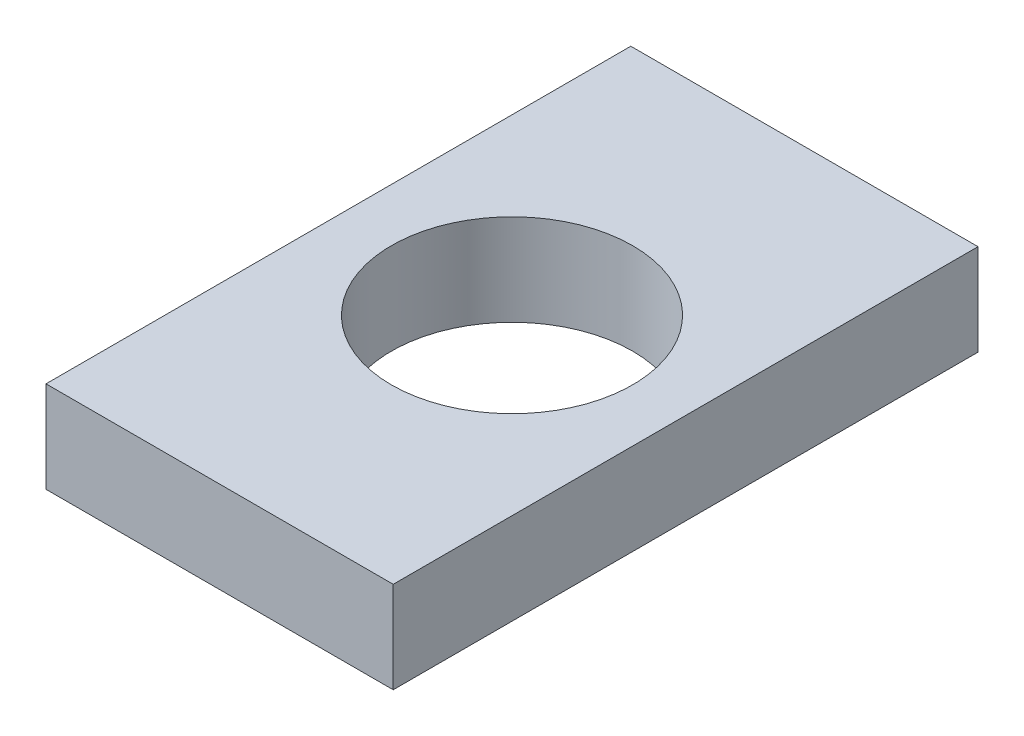
ISO-10303-21;
HEADER;
FILE_DESCRIPTION(('STEP AP214'),'2;1');
FILE_NAME('part.step','',(''),(''),'','','');
FILE_SCHEMA(('AUTOMOTIVE_DESIGN { 1 0 10303 214 1 1 1 1 }'));
ENDSEC;
DATA;
#1=APPLICATION_CONTEXT('core data for automotive mechanical design processes');
#2=APPLICATION_PROTOCOL_DEFINITION('international standard','automotive_design',2000,#1);
#3=PRODUCT_CONTEXT('',#1,'mechanical');
#4=PRODUCT('Part','Part','',(#3));
#5=PRODUCT_RELATED_PRODUCT_CATEGORY('part','',(#4));
#6=PRODUCT_DEFINITION_FORMATION('','',#4);
#7=PRODUCT_DEFINITION_CONTEXT('part definition',#1,'design');
#8=PRODUCT_DEFINITION('design','',#6,#7);
#9=PRODUCT_DEFINITION_SHAPE('','',#8);
#10=(LENGTH_UNIT() NAMED_UNIT(*) SI_UNIT(.MILLI.,.METRE.));
#11=(NAMED_UNIT(*) PLANE_ANGLE_UNIT() SI_UNIT($,.RADIAN.));
#12=(NAMED_UNIT(*) SI_UNIT($,.STERADIAN.) SOLID_ANGLE_UNIT());
#13=UNCERTAINTY_MEASURE_WITH_UNIT(LENGTH_MEASURE(1.E-05),#10,'distance_accuracy_value','');
#14=(GEOMETRIC_REPRESENTATION_CONTEXT(3) GLOBAL_UNCERTAINTY_ASSIGNED_CONTEXT((#13)) GLOBAL_UNIT_ASSIGNED_CONTEXT((#10,
#11,#12)) REPRESENTATION_CONTEXT('',''));
#15=CARTESIAN_POINT('',(0.,0.,0.));
#16=DIRECTION('',(0.,0.,1.));
#17=DIRECTION('',(1.,0.,0.));
#18=AXIS2_PLACEMENT_3D('',#15,#16,#17);
#19=CARTESIAN_POINT('',(-3.88578058618805E-13,1.24999999999997,5.55111512312578E-13));
#20=DIRECTION('',(1.00000000000001,0.,0.));
#21=DIRECTION('',(0.,0.,-0.999999999999994));
#22=AXIS2_PLACEMENT_3D('',#19,#20,#21);
#23=PLANE('',#22);
#24=DIRECTION('',(0.,0.,0.999999999999994));
#25=VECTOR('',#24,1.);
#26=CARTESIAN_POINT('',(0.,0.,0.));
#27=LINE('',#26,#25);
#28=CARTESIAN_POINT('',(-3.88578058618805E-13,1.70002900645727E-13,-7.99999999999956));
#29=VERTEX_POINT('',#28);
#30=CARTESIAN_POINT('',(0.,0.,0.));
#31=VERTEX_POINT('',#30);
#32=EDGE_CURVE('E117',#29,#31,#27,.T.);
#33=ORIENTED_EDGE('',*,*,#32,.T.);
#34=DIRECTION('',(0.,-0.999999999999992,0.));
#35=VECTOR('',#34,1.);
#36=CARTESIAN_POINT('',(-3.88578058618805E-13,1.24999999999997,5.55111512312578E-13));
#37=LINE('',#36,#35);
#38=CARTESIAN_POINT('',(-3.88578058618805E-13,1.24999999999997,5.55111512312578E-13));
#39=VERTEX_POINT('',#38);
#40=EDGE_CURVE('E13',#39,#31,#37,.T.);
#41=ORIENTED_EDGE('',*,*,#40,.F.);
#42=DIRECTION('',(0.,0.,0.999999999999994));
#43=VECTOR('',#42,1.);
#44=CARTESIAN_POINT('',(-3.88578058618805E-13,1.24999999999997,5.55111512312578E-13));
#45=LINE('',#44,#43);
#46=CARTESIAN_POINT('',(-3.88578058618805E-13,1.24999999999998,-7.9999999999994));
#47=VERTEX_POINT('',#46);
#48=EDGE_CURVE('E105',#47,#39,#45,.T.);
#49=ORIENTED_EDGE('',*,*,#48,.F.);
#50=DIRECTION('',(0.,-0.999999999999992,0.));
#51=VECTOR('',#50,1.);
#52=CARTESIAN_POINT('',(-3.88578058618805E-13,1.24999999999998,-7.9999999999994));
#53=LINE('',#52,#51);
#54=EDGE_CURVE('E113',#47,#29,#53,.T.);
#55=ORIENTED_EDGE('',*,*,#54,.T.);
#56=EDGE_LOOP('',(#33,#41,#49,#55));
#57=FACE_BOUND('',#56,.T.);
#58=ADVANCED_FACE('F54',(#57),#23,.F.);
#59=CARTESIAN_POINT('',(-3.88578058618805E-13,1.24999999999997,5.55111512312578E-13));
#60=DIRECTION('',(0.,0.,-0.999999999999994));
#61=DIRECTION('',(-1.00000000000001,0.,0.));
#62=AXIS2_PLACEMENT_3D('',#59,#60,#61);
#63=PLANE('',#62);
#64=DIRECTION('',(1.00000000000001,0.,0.));
#65=VECTOR('',#64,1.);
#66=CARTESIAN_POINT('',(0.,0.,0.));
#67=LINE('',#66,#65);
#68=CARTESIAN_POINT('',(4.74999999999959,1.11022302462516E-13,2.22044604925031E-13));
#69=VERTEX_POINT('',#68);
#70=EDGE_CURVE('E109',#31,#69,#67,.T.);
#71=ORIENTED_EDGE('',*,*,#70,.T.);
#72=DIRECTION('',(0.,-0.999999999999992,0.));
#73=VECTOR('',#72,1.);
#74=CARTESIAN_POINT('',(4.74999999999964,1.24999999999997,4.44089209850063E-13));
#75=LINE('',#74,#73);
#76=CARTESIAN_POINT('',(4.74999999999964,1.24999999999997,4.44089209850063E-13));
#77=VERTEX_POINT('',#76);
#78=EDGE_CURVE('E62',#77,#69,#75,.T.);
#79=ORIENTED_EDGE('',*,*,#78,.F.);
#80=DIRECTION('',(1.00000000000001,0.,0.));
#81=VECTOR('',#80,1.);
#82=CARTESIAN_POINT('',(-3.88578058618805E-13,1.24999999999997,5.55111512312578E-13));
#83=LINE('',#82,#81);
#84=EDGE_CURVE('E100',#39,#77,#83,.T.);
#85=ORIENTED_EDGE('',*,*,#84,.F.);
#86=ORIENTED_EDGE('',*,*,#40,.T.);
#87=EDGE_LOOP('',(#71,#79,#85,#86));
#88=FACE_BOUND('',#87,.T.);
#89=ADVANCED_FACE('F108',(#88),#63,.F.);
#90=CARTESIAN_POINT('',(4.74999999999964,1.24999999999997,4.44089209850063E-13));
#91=DIRECTION('',(-1.00000000000001,0.,0.));
#92=DIRECTION('',(0.,0.,0.999999999999994));
#93=AXIS2_PLACEMENT_3D('',#90,#91,#92);
#94=PLANE('',#93);
#95=DIRECTION('',(0.,0.,-0.999999999999994));
#96=VECTOR('',#95,1.);
#97=CARTESIAN_POINT('',(4.74999999999959,1.11022302462516E-13,2.22044604925031E-13));
#98=LINE('',#97,#96);
#99=CARTESIAN_POINT('',(4.74999999999992,1.66533453693773E-13,-7.99999999999995));
#100=VERTEX_POINT('',#99);
#101=EDGE_CURVE('E87',#69,#100,#98,.T.);
#102=ORIENTED_EDGE('',*,*,#101,.T.);
#103=DIRECTION('',(0.,-0.999999999999992,0.));
#104=VECTOR('',#103,1.);
#105=CARTESIAN_POINT('',(4.7499999999997,1.25000000000014,-7.99999999999967));
#106=LINE('',#105,#104);
#107=CARTESIAN_POINT('',(4.7499999999997,1.25000000000014,-7.99999999999967));
#108=VERTEX_POINT('',#107);
#109=EDGE_CURVE('E110',#108,#100,#106,.T.);
#110=ORIENTED_EDGE('',*,*,#109,.F.);
#111=DIRECTION('',(0.,0.,-0.999999999999994));
#112=VECTOR('',#111,1.);
#113=CARTESIAN_POINT('',(4.74999999999964,1.24999999999997,4.44089209850063E-13));
#114=LINE('',#113,#112);
#115=EDGE_CURVE('E103',#77,#108,#114,.T.);
#116=ORIENTED_EDGE('',*,*,#115,.F.);
#117=ORIENTED_EDGE('',*,*,#78,.T.);
#118=EDGE_LOOP('',(#102,#110,#116,#117));
#119=FACE_BOUND('',#118,.T.);
#120=ADVANCED_FACE('F111',(#119),#94,.F.);
#121=CARTESIAN_POINT('',(-3.88578058618805E-13,1.24999999999998,-7.9999999999994));
#122=DIRECTION('',(0.,0.,0.999999999999993));
#123=DIRECTION('',(1.00000000000001,0.,0.));
#124=AXIS2_PLACEMENT_3D('',#121,#122,#123);
#125=PLANE('',#124);
#126=DIRECTION('',(-1.00000000000001,0.,0.));
#127=VECTOR('',#126,1.);
#128=CARTESIAN_POINT('',(-3.88578058618805E-13,1.70002900645727E-13,-7.99999999999956));
#129=LINE('',#128,#127);
#130=EDGE_CURVE('E93',#100,#29,#129,.T.);
#131=ORIENTED_EDGE('',*,*,#130,.T.);
#132=ORIENTED_EDGE('',*,*,#54,.F.);
#133=DIRECTION('',(-1.00000000000001,0.,0.));
#134=VECTOR('',#133,1.);
#135=CARTESIAN_POINT('',(-3.88578058618805E-13,1.24999999999998,-7.9999999999994));
#136=LINE('',#135,#134);
#137=EDGE_CURVE('E70',#108,#47,#136,.T.);
#138=ORIENTED_EDGE('',*,*,#137,.F.);
#139=ORIENTED_EDGE('',*,*,#109,.T.);
#140=EDGE_LOOP('',(#131,#132,#138,#139));
#141=FACE_BOUND('',#140,.T.);
#142=ADVANCED_FACE('F125',(#141),#125,.F.);
#143=CARTESIAN_POINT('',(-3.88578058618805E-13,1.24999999999997,5.55111512312578E-13));
#144=DIRECTION('',(0.,-0.999999999999992,0.));
#145=DIRECTION('',(0.,0.,-0.999999999999994));
#146=AXIS2_PLACEMENT_3D('',#143,#144,#145);
#147=PLANE('',#146);
#148=CARTESIAN_POINT('',(2.37499999999952,1.24999999999997,-3.99999999999961));
#149=DIRECTION('',(0.,0.999999999999992,0.));
#150=DIRECTION('',(0.,0.,0.999999999999994));
#151=AXIS2_PLACEMENT_3D('',#148,#149,#150);
#152=CIRCLE('',#151,1.65);
#153=CARTESIAN_POINT('',(2.37499999999952,1.24999999999997,-2.34999999999963));
#154=VERTEX_POINT('',#153);
#155=EDGE_CURVE('E133',#154,#154,#152,.T.);
#156=ORIENTED_EDGE('',*,*,#155,.F.);
#157=EDGE_LOOP('',(#156));
#158=FACE_BOUND('',#157,.T.);
#159=ORIENTED_EDGE('',*,*,#48,.T.);
#160=ORIENTED_EDGE('',*,*,#84,.T.);
#161=ORIENTED_EDGE('',*,*,#115,.T.);
#162=ORIENTED_EDGE('',*,*,#137,.T.);
#163=EDGE_LOOP('',(#159,#160,#161,#162));
#164=FACE_BOUND('',#163,.T.);
#165=ADVANCED_FACE('F101',(#158,#164),#147,.F.);
#166=CARTESIAN_POINT('',(0.,0.,0.));
#167=DIRECTION('',(0.,-0.999999999999992,0.));
#168=DIRECTION('',(0.,0.,-0.999999999999994));
#169=AXIS2_PLACEMENT_3D('',#166,#167,#168);
#170=PLANE('',#169);
#171=CARTESIAN_POINT('',(2.37499999999985,0.,-3.99999999999956));
#172=DIRECTION('',(0.,0.999999999999992,0.));
#173=DIRECTION('',(0.,0.,0.999999999999994));
#174=AXIS2_PLACEMENT_3D('',#171,#172,#173);
#175=CIRCLE('',#174,1.65);
#176=CARTESIAN_POINT('',(2.37499999999952,0.,-2.34999999999963));
#177=VERTEX_POINT('',#176);
#178=EDGE_CURVE('E120',#177,#177,#175,.T.);
#179=ORIENTED_EDGE('',*,*,#178,.T.);
#180=EDGE_LOOP('',(#179));
#181=FACE_BOUND('',#180,.T.);
#182=ORIENTED_EDGE('',*,*,#32,.F.);
#183=ORIENTED_EDGE('',*,*,#130,.F.);
#184=ORIENTED_EDGE('',*,*,#101,.F.);
#185=ORIENTED_EDGE('',*,*,#70,.F.);
#186=EDGE_LOOP('',(#182,#183,#184,#185));
#187=FACE_BOUND('',#186,.T.);
#188=ADVANCED_FACE('F128',(#181,#187),#170,.T.);
#189=CARTESIAN_POINT('',(2.37499999999952,1.24999999999997,-3.99999999999961));
#190=DIRECTION('',(0.,0.999999999999992,0.));
#191=DIRECTION('',(0.,0.,0.999999999999994));
#192=AXIS2_PLACEMENT_3D('',#189,#190,#191);
#193=CYLINDRICAL_SURFACE('',#192,1.65);
#194=CARTESIAN_POINT('',(2.37499999999952,0.,-2.34999999999963));
#195=CARTESIAN_POINT('',(2.37499999999952,0.0130208333333313,-2.34999999999963));
#196=CARTESIAN_POINT('',(2.37499999999952,0.0260416666666644,-2.34999999999963));
#197=CARTESIAN_POINT('',(2.37499999999952,0.0520833333333305,-2.34999999999963));
#198=CARTESIAN_POINT('',(2.37499999999952,0.0651041666666635,-2.34999999999963));
#199=CARTESIAN_POINT('',(2.37499999999952,0.0911458333333297,-2.34999999999963));
#200=CARTESIAN_POINT('',(2.37499999999952,0.104166666666663,-2.34999999999963));
#201=CARTESIAN_POINT('',(2.37499999999952,0.130208333333329,-2.34999999999963));
#202=CARTESIAN_POINT('',(2.37499999999952,0.143229166666662,-2.34999999999963));
#203=CARTESIAN_POINT('',(2.37499999999952,0.169270833333328,-2.34999999999963));
#204=CARTESIAN_POINT('',(2.37499999999952,0.182291666666661,-2.34999999999963));
#205=CARTESIAN_POINT('',(2.37499999999952,0.208333333333327,-2.34999999999963));
#206=CARTESIAN_POINT('',(2.37499999999952,0.22135416666666,-2.34999999999963));
#207=CARTESIAN_POINT('',(2.37499999999952,0.247395833333326,-2.34999999999963));
#208=CARTESIAN_POINT('',(2.37499999999952,0.260416666666659,-2.34999999999963));
#209=CARTESIAN_POINT('',(2.37499999999952,0.286458333333326,-2.34999999999963));
#210=CARTESIAN_POINT('',(2.37499999999952,0.299479166666659,-2.34999999999963));
#211=CARTESIAN_POINT('',(2.37499999999952,0.325520833333325,-2.34999999999963));
#212=CARTESIAN_POINT('',(2.37499999999952,0.338541666666658,-2.34999999999963));
#213=CARTESIAN_POINT('',(2.37499999999952,0.364583333333324,-2.34999999999963));
#214=CARTESIAN_POINT('',(2.37499999999952,0.377604166666657,-2.34999999999963));
#215=CARTESIAN_POINT('',(2.37499999999952,0.403645833333323,-2.34999999999963));
#216=CARTESIAN_POINT('',(2.37499999999952,0.416666666666656,-2.34999999999963));
#217=CARTESIAN_POINT('',(2.37499999999952,0.442708333333322,-2.34999999999963));
#218=CARTESIAN_POINT('',(2.37499999999952,0.455729166666655,-2.34999999999963));
#219=CARTESIAN_POINT('',(2.37499999999952,0.481770833333321,-2.34999999999963));
#220=CARTESIAN_POINT('',(2.37499999999952,0.494791666666654,-2.34999999999963));
#221=CARTESIAN_POINT('',(2.37499999999952,0.520833333333321,-2.34999999999963));
#222=CARTESIAN_POINT('',(2.37499999999952,0.533854166666654,-2.34999999999963));
#223=CARTESIAN_POINT('',(2.37499999999952,0.55989583333332,-2.34999999999963));
#224=CARTESIAN_POINT('',(2.37499999999952,0.572916666666653,-2.34999999999963));
#225=CARTESIAN_POINT('',(2.37499999999952,0.598958333333319,-2.34999999999963));
#226=CARTESIAN_POINT('',(2.37499999999952,0.611979166666652,-2.34999999999963));
#227=CARTESIAN_POINT('',(2.37499999999952,0.638020833333318,-2.34999999999963));
#228=CARTESIAN_POINT('',(2.37499999999952,0.651041666666651,-2.34999999999963));
#229=CARTESIAN_POINT('',(2.37499999999952,0.677083333333317,-2.34999999999963));
#230=CARTESIAN_POINT('',(2.37499999999952,0.69010416666665,-2.34999999999963));
#231=CARTESIAN_POINT('',(2.37499999999952,0.716145833333316,-2.34999999999963));
#232=CARTESIAN_POINT('',(2.37499999999952,0.729166666666649,-2.34999999999963));
#233=CARTESIAN_POINT('',(2.37499999999952,0.755208333333316,-2.34999999999963));
#234=CARTESIAN_POINT('',(2.37499999999952,0.768229166666649,-2.34999999999963));
#235=CARTESIAN_POINT('',(2.37499999999952,0.794270833333315,-2.34999999999963));
#236=CARTESIAN_POINT('',(2.37499999999952,0.807291666666648,-2.34999999999963));
#237=CARTESIAN_POINT('',(2.37499999999952,0.833333333333314,-2.34999999999963));
#238=CARTESIAN_POINT('',(2.37499999999952,0.846354166666647,-2.34999999999963));
#239=CARTESIAN_POINT('',(2.37499999999952,0.872395833333313,-2.34999999999963));
#240=CARTESIAN_POINT('',(2.37499999999952,0.885416666666646,-2.34999999999963));
#241=CARTESIAN_POINT('',(2.37499999999952,0.911458333333312,-2.34999999999963));
#242=CARTESIAN_POINT('',(2.37499999999952,0.924479166666645,-2.34999999999963));
#243=CARTESIAN_POINT('',(2.37499999999952,0.950520833333311,-2.34999999999963));
#244=CARTESIAN_POINT('',(2.37499999999952,0.963541666666644,-2.34999999999963));
#245=CARTESIAN_POINT('',(2.37499999999952,0.989583333333311,-2.34999999999963));
#246=CARTESIAN_POINT('',(2.37499999999952,1.00260416666664,-2.34999999999963));
#247=CARTESIAN_POINT('',(2.37499999999952,1.02864583333331,-2.34999999999963));
#248=CARTESIAN_POINT('',(2.37499999999952,1.04166666666664,-2.34999999999963));
#249=CARTESIAN_POINT('',(2.37499999999952,1.06770833333331,-2.34999999999963));
#250=CARTESIAN_POINT('',(2.37499999999952,1.08072916666664,-2.34999999999963));
#251=CARTESIAN_POINT('',(2.37499999999952,1.10677083333331,-2.34999999999963));
#252=CARTESIAN_POINT('',(2.37499999999952,1.11979166666664,-2.34999999999963));
#253=CARTESIAN_POINT('',(2.37499999999952,1.14583333333331,-2.34999999999963));
#254=CARTESIAN_POINT('',(2.37499999999952,1.15885416666664,-2.34999999999963));
#255=CARTESIAN_POINT('',(2.37499999999952,1.18489583333331,-2.34999999999963));
#256=CARTESIAN_POINT('',(2.37499999999952,1.19791666666664,-2.34999999999963));
#257=CARTESIAN_POINT('',(2.37499999999952,1.22395833333331,-2.34999999999963));
#258=CARTESIAN_POINT('',(2.37499999999952,1.23697916666664,-2.34999999999963));
#259=CARTESIAN_POINT('',(2.37499999999952,1.24999999999997,-2.34999999999963));
#260=B_SPLINE_CURVE_WITH_KNOTS('',3,(#194,#195,#196,#197,#198,#199,#200,#201,#202,#203,#204,
#205,#206,#207,#208,#209,#210,#211,#212,#213,#214,#215,#216,#217,#218,#219,#220,#221,#222,#223,
#224,#225,#226,#227,#228,#229,#230,#231,#232,#233,#234,#235,#236,#237,#238,#239,#240,#241,#242,
#243,#244,#245,#246,#247,#248,#249,#250,#251,#252,#253,#254,#255,#256,#257,#258,#259),
.UNSPECIFIED.,.F.,.F.,(4,2,2,2,2,2,2,2,2,2,2,2,2,2,2,2,2,2,2,2,2,2,2,2,2,2,2,2,2,2,2,2,4),(0.,
0.0390624999999992,0.0781249999999983,0.117187499999998,0.156249999999997,0.195312499999996,
0.234374999999995,0.273437499999994,0.312499999999993,0.351562499999993,0.390624999999992,
0.429687499999991,0.46874999999999,0.507812499999989,0.546874999999988,0.585937499999988,
0.624999999999987,0.664062499999986,0.703124999999985,0.742187499999984,0.781249999999984,
0.820312499999983,0.859374999999982,0.898437499999981,0.93749999999998,0.976562499999979,
1.01562499999998,1.05468749999998,1.09374999999998,1.13281249999998,1.17187499999998,
1.21093749999997,1.24999999999997),.UNSPECIFIED.);
#261=EDGE_CURVE('BSEAM137',#177,#154,#260,.T.);
#262=ORIENTED_EDGE('',*,*,#178,.F.);
#263=ORIENTED_EDGE('',*,*,#155,.T.);
#264=ORIENTED_EDGE('',*,*,#261,.T.);
#265=ORIENTED_EDGE('',*,*,#261,.F.);
#266=EDGE_LOOP('',(#262,#264,#263,#265));
#267=FACE_BOUND('',#266,.T.);
#268=ADVANCED_FACE('F137',(#267),#193,.F.);
#269=CLOSED_SHELL('',(#58,#89,#120,#142,#165,#188,#268));
#270=MANIFOLD_SOLID_BREP('B2',#269);
#271=ADVANCED_BREP_SHAPE_REPRESENTATION('',(#18,#270),#14);
#272=SHAPE_DEFINITION_REPRESENTATION(#9,#271);
ENDSEC;
END-ISO-10303-21;
